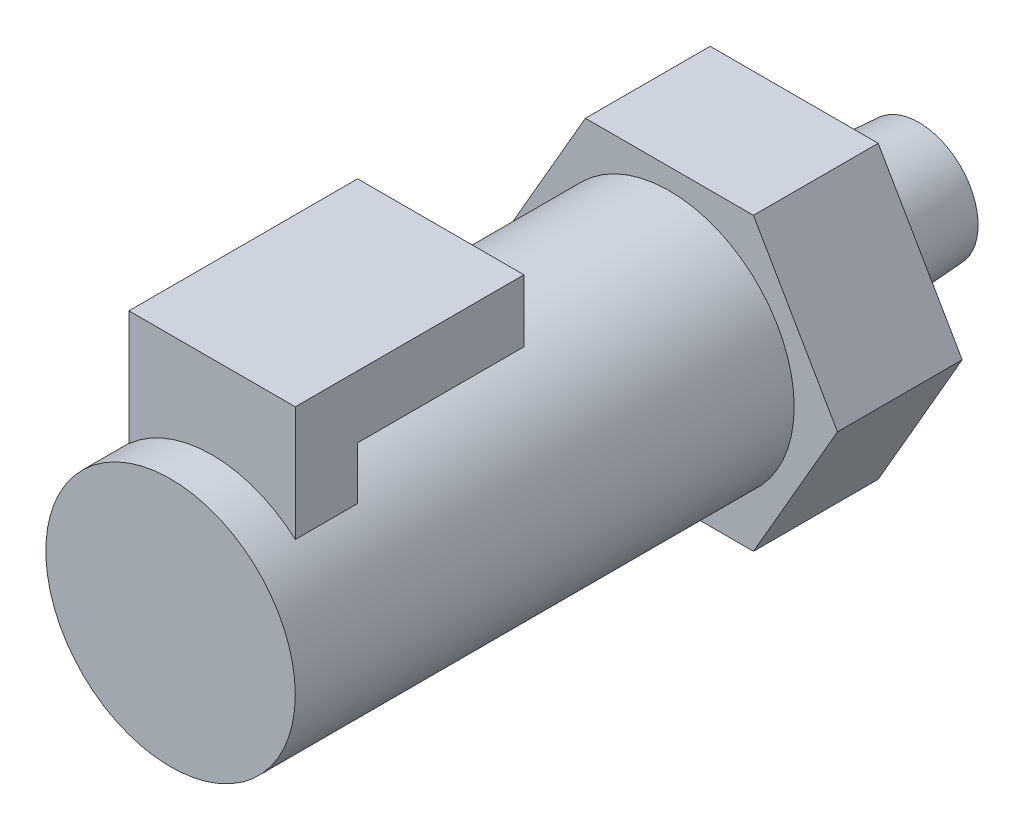
ISO-10303-21;
HEADER;
FILE_DESCRIPTION(('STEP AP214'),'2;1');
FILE_NAME('part.step','',(''),(''),'','','');
FILE_SCHEMA(('AUTOMOTIVE_DESIGN { 1 0 10303 214 1 1 1 1 }'));
ENDSEC;
DATA;
#1=APPLICATION_CONTEXT('core data for automotive mechanical design processes');
#2=APPLICATION_PROTOCOL_DEFINITION('international standard','automotive_design',2000,#1);
#3=PRODUCT_CONTEXT('',#1,'mechanical');
#4=PRODUCT('Part','Part','',(#3));
#5=PRODUCT_RELATED_PRODUCT_CATEGORY('part','',(#4));
#6=PRODUCT_DEFINITION_FORMATION('','',#4);
#7=PRODUCT_DEFINITION_CONTEXT('part definition',#1,'design');
#8=PRODUCT_DEFINITION('design','',#6,#7);
#9=PRODUCT_DEFINITION_SHAPE('','',#8);
#10=(LENGTH_UNIT() NAMED_UNIT(*) SI_UNIT(.MILLI.,.METRE.));
#11=(NAMED_UNIT(*) PLANE_ANGLE_UNIT() SI_UNIT($,.RADIAN.));
#12=(NAMED_UNIT(*) SI_UNIT($,.STERADIAN.) SOLID_ANGLE_UNIT());
#13=UNCERTAINTY_MEASURE_WITH_UNIT(LENGTH_MEASURE(1.E-05),#10,'distance_accuracy_value','');
#14=(GEOMETRIC_REPRESENTATION_CONTEXT(3) GLOBAL_UNCERTAINTY_ASSIGNED_CONTEXT((#13)) GLOBAL_UNIT_ASSIGNED_CONTEXT((#10,
#11,#12)) REPRESENTATION_CONTEXT('',''));
#15=CARTESIAN_POINT('',(0.,0.,0.));
#16=DIRECTION('',(0.,0.,1.));
#17=DIRECTION('',(1.,0.,0.));
#18=AXIS2_PLACEMENT_3D('',#15,#16,#17);
#19=CARTESIAN_POINT('',(-6.35,0.,39.6875));
#20=DIRECTION('',(0.,0.,-1.));
#21=DIRECTION('',(-1.,0.,0.));
#22=AXIS2_PLACEMENT_3D('',#19,#20,#21);
#23=PLANE('',#22);
#24=DIRECTION('',(0.,1.,0.));
#25=VECTOR('',#24,1.);
#26=CARTESIAN_POINT('',(-6.35,0.,39.6875));
#27=LINE('',#26,#25);
#28=CARTESIAN_POINT('',(-6.34999999999999,7.09951582856184,39.6875));
#29=VERTEX_POINT('',#28);
#30=CARTESIAN_POINT('',(-6.34999999999999,11.1125,39.6875));
#31=VERTEX_POINT('',#30);
#32=EDGE_CURVE('E171',#29,#31,#27,.T.);
#33=ORIENTED_EDGE('',*,*,#32,.T.);
#34=DIRECTION('',(-1.,0.,0.));
#35=VECTOR('',#34,1.);
#36=CARTESIAN_POINT('',(6.35,11.1125,39.6875));
#37=LINE('',#36,#35);
#38=CARTESIAN_POINT('',(6.35,11.1125,39.6875));
#39=VERTEX_POINT('',#38);
#40=EDGE_CURVE('E403',#39,#31,#37,.T.);
#41=ORIENTED_EDGE('',*,*,#40,.F.);
#42=DIRECTION('',(0.,1.,0.));
#43=VECTOR('',#42,1.);
#44=CARTESIAN_POINT('',(6.35,0.,39.6875));
#45=LINE('',#44,#43);
#46=CARTESIAN_POINT('',(6.35,7.09951582856183,39.6875));
#47=VERTEX_POINT('',#46);
#48=EDGE_CURVE('E173',#47,#39,#45,.T.);
#49=ORIENTED_EDGE('',*,*,#48,.F.);
#50=CARTESIAN_POINT('',(0.,0.,39.6875));
#51=DIRECTION('',(0.,0.,-1.));
#52=DIRECTION('',(-1.,0.,0.));
#53=AXIS2_PLACEMENT_3D('',#50,#51,#52);
#54=CIRCLE('',#53,9.525);
#55=EDGE_CURVE('E40',#29,#47,#54,.T.);
#56=ORIENTED_EDGE('',*,*,#55,.F.);
#57=EDGE_LOOP('',(#33,#41,#49,#56));
#58=FACE_BOUND('',#57,.T.);
#59=ADVANCED_FACE('F32',(#58),#23,.T.);
#60=CARTESIAN_POINT('',(12.8316097327394,0.,9.525));
#61=DIRECTION('',(-0.866025403784439,-0.5,0.));
#62=DIRECTION('',(0.5,-0.866025403784438,0.));
#63=AXIS2_PLACEMENT_3D('',#60,#61,#62);
#64=PLANE('',#63);
#65=DIRECTION('',(-0.5,0.866025403784438,0.));
#66=VECTOR('',#65,1.);
#67=CARTESIAN_POINT('',(12.8316097327394,0.,0.));
#68=LINE('',#67,#66);
#69=CARTESIAN_POINT('',(12.8316097327394,0.,0.));
#70=VERTEX_POINT('',#69);
#71=CARTESIAN_POINT('',(6.41580486636971,11.1125,0.));
#72=VERTEX_POINT('',#71);
#73=EDGE_CURVE('E129',#70,#72,#68,.T.);
#74=ORIENTED_EDGE('',*,*,#73,.T.);
#75=DIRECTION('',(0.,0.,-1.));
#76=VECTOR('',#75,1.);
#77=CARTESIAN_POINT('',(6.41580486636971,11.1125,9.525));
#78=LINE('',#77,#76);
#79=CARTESIAN_POINT('',(6.41580486636971,11.1125,9.525));
#80=VERTEX_POINT('',#79);
#81=EDGE_CURVE('E148',#80,#72,#78,.T.);
#82=ORIENTED_EDGE('',*,*,#81,.F.);
#83=DIRECTION('',(-0.5,0.866025403784438,0.));
#84=VECTOR('',#83,1.);
#85=CARTESIAN_POINT('',(12.8316097327394,0.,9.525));
#86=LINE('',#85,#84);
#87=CARTESIAN_POINT('',(12.8316097327394,0.,9.525));
#88=VERTEX_POINT('',#87);
#89=EDGE_CURVE('E141',#88,#80,#86,.T.);
#90=ORIENTED_EDGE('',*,*,#89,.F.);
#91=DIRECTION('',(0.,0.,-1.));
#92=VECTOR('',#91,1.);
#93=CARTESIAN_POINT('',(12.8316097327394,0.,9.525));
#94=LINE('',#93,#92);
#95=EDGE_CURVE('E125',#88,#70,#94,.T.);
#96=ORIENTED_EDGE('',*,*,#95,.T.);
#97=EDGE_LOOP('',(#74,#82,#90,#96));
#98=FACE_BOUND('',#97,.T.);
#99=ADVANCED_FACE('F34',(#98),#64,.F.);
#100=CARTESIAN_POINT('',(6.41580486636971,11.1125,9.525));
#101=DIRECTION('',(0.,-1.,0.));
#102=DIRECTION('',(1.,0.,0.));
#103=AXIS2_PLACEMENT_3D('',#100,#101,#102);
#104=PLANE('',#103);
#105=DIRECTION('',(-1.,0.,0.));
#106=VECTOR('',#105,1.);
#107=CARTESIAN_POINT('',(6.41580486636971,11.1125,0.));
#108=LINE('',#107,#106);
#109=CARTESIAN_POINT('',(-6.41580486636972,11.1125,0.));
#110=VERTEX_POINT('',#109);
#111=EDGE_CURVE('E132',#72,#110,#108,.T.);
#112=ORIENTED_EDGE('',*,*,#111,.T.);
#113=DIRECTION('',(0.,0.,-1.));
#114=VECTOR('',#113,1.);
#115=CARTESIAN_POINT('',(-6.41580486636972,11.1125,9.525));
#116=LINE('',#115,#114);
#117=CARTESIAN_POINT('',(-6.41580486636972,11.1125,9.525));
#118=VERTEX_POINT('',#117);
#119=EDGE_CURVE('E145',#118,#110,#116,.T.);
#120=ORIENTED_EDGE('',*,*,#119,.F.);
#121=DIRECTION('',(-1.,0.,0.));
#122=VECTOR('',#121,1.);
#123=CARTESIAN_POINT('',(6.41580486636971,11.1125,9.525));
#124=LINE('',#123,#122);
#125=EDGE_CURVE('E92',#80,#118,#124,.T.);
#126=ORIENTED_EDGE('',*,*,#125,.F.);
#127=ORIENTED_EDGE('',*,*,#81,.T.);
#128=EDGE_LOOP('',(#112,#120,#126,#127));
#129=FACE_BOUND('',#128,.T.);
#130=ADVANCED_FACE('F202',(#129),#104,.F.);
#131=CARTESIAN_POINT('',(-6.41580486636972,11.1125,9.525));
#132=DIRECTION('',(0.866025403784439,-0.5,0.));
#133=DIRECTION('',(0.5,0.866025403784438,0.));
#134=AXIS2_PLACEMENT_3D('',#131,#132,#133);
#135=PLANE('',#134);
#136=DIRECTION('',(-0.5,-0.866025403784438,0.));
#137=VECTOR('',#136,1.);
#138=CARTESIAN_POINT('',(-6.41580486636972,11.1125,0.));
#139=LINE('',#138,#137);
#140=CARTESIAN_POINT('',(-12.8316097327394,0.,0.));
#141=VERTEX_POINT('',#140);
#142=EDGE_CURVE('E135',#110,#141,#139,.T.);
#143=ORIENTED_EDGE('',*,*,#142,.T.);
#144=DIRECTION('',(0.,0.,-1.));
#145=VECTOR('',#144,1.);
#146=CARTESIAN_POINT('',(-12.8316097327394,0.,9.525));
#147=LINE('',#146,#145);
#148=CARTESIAN_POINT('',(-12.8316097327394,0.,9.525));
#149=VERTEX_POINT('',#148);
#150=EDGE_CURVE('E120',#149,#141,#147,.T.);
#151=ORIENTED_EDGE('',*,*,#150,.F.);
#152=DIRECTION('',(-0.5,-0.866025403784438,0.));
#153=VECTOR('',#152,1.);
#154=CARTESIAN_POINT('',(-6.41580486636972,11.1125,9.525));
#155=LINE('',#154,#153);
#156=EDGE_CURVE('E108',#118,#149,#155,.T.);
#157=ORIENTED_EDGE('',*,*,#156,.F.);
#158=ORIENTED_EDGE('',*,*,#119,.T.);
#159=EDGE_LOOP('',(#143,#151,#157,#158));
#160=FACE_BOUND('',#159,.T.);
#161=ADVANCED_FACE('F205',(#160),#135,.F.);
#162=CARTESIAN_POINT('',(-12.8316097327394,0.,9.525));
#163=DIRECTION('',(0.866025403784439,0.5,0.));
#164=DIRECTION('',(-0.5,0.866025403784439,0.));
#165=AXIS2_PLACEMENT_3D('',#162,#163,#164);
#166=PLANE('',#165);
#167=DIRECTION('',(0.5,-0.866025403784439,0.));
#168=VECTOR('',#167,1.);
#169=CARTESIAN_POINT('',(-12.8316097327394,0.,0.));
#170=LINE('',#169,#168);
#171=CARTESIAN_POINT('',(-6.41580486636971,-11.1125,0.));
#172=VERTEX_POINT('',#171);
#173=EDGE_CURVE('E117',#141,#172,#170,.T.);
#174=ORIENTED_EDGE('',*,*,#173,.T.);
#175=DIRECTION('',(0.,0.,-1.));
#176=VECTOR('',#175,1.);
#177=CARTESIAN_POINT('',(-6.41580486636971,-11.1125,9.525));
#178=LINE('',#177,#176);
#179=CARTESIAN_POINT('',(-6.41580486636971,-11.1125,9.525));
#180=VERTEX_POINT('',#179);
#181=EDGE_CURVE('E114',#180,#172,#178,.T.);
#182=ORIENTED_EDGE('',*,*,#181,.F.);
#183=DIRECTION('',(0.5,-0.866025403784439,0.));
#184=VECTOR('',#183,1.);
#185=CARTESIAN_POINT('',(-12.8316097327394,0.,9.525));
#186=LINE('',#185,#184);
#187=EDGE_CURVE('E101',#149,#180,#186,.T.);
#188=ORIENTED_EDGE('',*,*,#187,.F.);
#189=ORIENTED_EDGE('',*,*,#150,.T.);
#190=EDGE_LOOP('',(#174,#182,#188,#189));
#191=FACE_BOUND('',#190,.T.);
#192=ADVANCED_FACE('F115',(#191),#166,.F.);
#193=CARTESIAN_POINT('',(-6.41580486636971,-11.1125,9.525));
#194=DIRECTION('',(0.,1.,0.));
#195=DIRECTION('',(0.,0.,1.));
#196=AXIS2_PLACEMENT_3D('',#193,#194,#195);
#197=PLANE('',#196);
#198=DIRECTION('',(1.,0.,0.));
#199=VECTOR('',#198,1.);
#200=CARTESIAN_POINT('',(-6.41580486636971,-11.1125,0.));
#201=LINE('',#200,#199);
#202=CARTESIAN_POINT('',(6.41580486636971,-11.1125,0.));
#203=VERTEX_POINT('',#202);
#204=EDGE_CURVE('E138',#172,#203,#201,.T.);
#205=ORIENTED_EDGE('',*,*,#204,.T.);
#206=DIRECTION('',(0.,0.,-1.));
#207=VECTOR('',#206,1.);
#208=CARTESIAN_POINT('',(6.41580486636971,-11.1125,9.525));
#209=LINE('',#208,#207);
#210=CARTESIAN_POINT('',(6.41580486636971,-11.1125,9.525));
#211=VERTEX_POINT('',#210);
#212=EDGE_CURVE('E121',#211,#203,#209,.T.);
#213=ORIENTED_EDGE('',*,*,#212,.F.);
#214=DIRECTION('',(1.,0.,0.));
#215=VECTOR('',#214,1.);
#216=CARTESIAN_POINT('',(-6.41580486636971,-11.1125,9.525));
#217=LINE('',#216,#215);
#218=EDGE_CURVE('E105',#180,#211,#217,.T.);
#219=ORIENTED_EDGE('',*,*,#218,.F.);
#220=ORIENTED_EDGE('',*,*,#181,.T.);
#221=EDGE_LOOP('',(#205,#213,#219,#220));
#222=FACE_BOUND('',#221,.T.);
#223=ADVANCED_FACE('F123',(#222),#197,.F.);
#224=CARTESIAN_POINT('',(6.41580486636971,-11.1125,9.525));
#225=DIRECTION('',(-0.866025403784439,0.5,0.));
#226=DIRECTION('',(-0.5,-0.866025403784438,0.));
#227=AXIS2_PLACEMENT_3D('',#224,#225,#226);
#228=PLANE('',#227);
#229=DIRECTION('',(0.5,0.866025403784438,0.));
#230=VECTOR('',#229,1.);
#231=CARTESIAN_POINT('',(6.41580486636971,-11.1125,0.));
#232=LINE('',#231,#230);
#233=EDGE_CURVE('E83',#203,#70,#232,.T.);
#234=ORIENTED_EDGE('',*,*,#233,.T.);
#235=ORIENTED_EDGE('',*,*,#95,.F.);
#236=DIRECTION('',(0.5,0.866025403784438,0.));
#237=VECTOR('',#236,1.);
#238=CARTESIAN_POINT('',(6.41580486636971,-11.1125,9.525));
#239=LINE('',#238,#237);
#240=EDGE_CURVE('E56',#211,#88,#239,.T.);
#241=ORIENTED_EDGE('',*,*,#240,.F.);
#242=ORIENTED_EDGE('',*,*,#212,.T.);
#243=EDGE_LOOP('',(#234,#235,#241,#242));
#244=FACE_BOUND('',#243,.T.);
#245=ADVANCED_FACE('F209',(#244),#228,.F.);
#246=CARTESIAN_POINT('',(0.,0.,9.525));
#247=DIRECTION('',(0.,0.,1.));
#248=DIRECTION('',(1.,0.,0.));
#249=AXIS2_PLACEMENT_3D('',#246,#247,#248);
#250=PLANE('',#249);
#251=CARTESIAN_POINT('',(0.,0.,9.525));
#252=DIRECTION('',(0.,0.,1.));
#253=DIRECTION('',(1.,0.,0.));
#254=AXIS2_PLACEMENT_3D('',#251,#252,#253);
#255=CIRCLE('',#254,9.525);
#256=CARTESIAN_POINT('',(9.525,0.,9.525));
#257=VERTEX_POINT('',#256);
#258=EDGE_CURVE('E155',#257,#257,#255,.T.);
#259=ORIENTED_EDGE('',*,*,#258,.F.);
#260=EDGE_LOOP('',(#259));
#261=FACE_BOUND('',#260,.T.);
#262=ORIENTED_EDGE('',*,*,#89,.T.);
#263=ORIENTED_EDGE('',*,*,#125,.T.);
#264=ORIENTED_EDGE('',*,*,#156,.T.);
#265=ORIENTED_EDGE('',*,*,#187,.T.);
#266=ORIENTED_EDGE('',*,*,#218,.T.);
#267=ORIENTED_EDGE('',*,*,#240,.T.);
#268=EDGE_LOOP('',(#262,#263,#264,#265,#266,#267));
#269=FACE_BOUND('',#268,.T.);
#270=ADVANCED_FACE('F103',(#261,#269),#250,.T.);
#271=CARTESIAN_POINT('',(0.,0.,0.));
#272=DIRECTION('',(0.,0.,1.));
#273=DIRECTION('',(1.,0.,0.));
#274=AXIS2_PLACEMENT_3D('',#271,#272,#273);
#275=PLANE('',#274);
#276=CARTESIAN_POINT('',(0.,0.,0.));
#277=DIRECTION('',(0.,0.,-1.));
#278=DIRECTION('',(-1.,0.,0.));
#279=AXIS2_PLACEMENT_3D('',#276,#277,#278);
#280=CIRCLE('',#279,5.1054);
#281=CARTESIAN_POINT('',(-5.1054,0.,0.));
#282=VERTEX_POINT('',#281);
#283=EDGE_CURVE('E150',#282,#282,#280,.T.);
#284=ORIENTED_EDGE('',*,*,#283,.F.);
#285=EDGE_LOOP('',(#284));
#286=FACE_BOUND('',#285,.T.);
#287=ORIENTED_EDGE('',*,*,#73,.F.);
#288=ORIENTED_EDGE('',*,*,#233,.F.);
#289=ORIENTED_EDGE('',*,*,#204,.F.);
#290=ORIENTED_EDGE('',*,*,#173,.F.);
#291=ORIENTED_EDGE('',*,*,#142,.F.);
#292=ORIENTED_EDGE('',*,*,#111,.F.);
#293=EDGE_LOOP('',(#287,#288,#289,#290,#291,#292));
#294=FACE_BOUND('',#293,.T.);
#295=ADVANCED_FACE('F208',(#286,#294),#275,.F.);
#296=CARTESIAN_POINT('',(0.,0.,0.));
#297=DIRECTION('',(0.,0.,1.));
#298=DIRECTION('',(-1.,0.,0.));
#299=AXIS2_PLACEMENT_3D('',#296,#297,#298);
#300=CONICAL_SURFACE('',#299,5.1054,0.0610865238198017);
#301=CARTESIAN_POINT('',(0.,0.,-9.525));
#302=DIRECTION('',(0.,0.,-1.));
#303=DIRECTION('',(-1.,0.,0.));
#304=AXIS2_PLACEMENT_3D('',#301,#302,#303);
#305=CIRCLE('',#304,4.52282604306664);
#306=CARTESIAN_POINT('',(-4.52282604306664,0.,-9.525));
#307=VERTEX_POINT('',#306);
#308=EDGE_CURVE('E133',#307,#307,#305,.T.);
#309=ORIENTED_EDGE('',*,*,#308,.F.);
#310=EDGE_LOOP('',(#309));
#311=FACE_BOUND('',#310,.T.);
#312=ORIENTED_EDGE('',*,*,#283,.T.);
#313=EDGE_LOOP('',(#312));
#314=FACE_BOUND('',#313,.T.);
#315=ADVANCED_FACE('F241',(#311,#314),#300,.T.);
#316=CARTESIAN_POINT('',(0.,0.,-9.525));
#317=DIRECTION('',(0.,0.,-1.));
#318=DIRECTION('',(-1.,0.,0.));
#319=AXIS2_PLACEMENT_3D('',#316,#317,#318);
#320=PLANE('',#319);
#321=ORIENTED_EDGE('',*,*,#308,.T.);
#322=EDGE_LOOP('',(#321));
#323=FACE_BOUND('',#322,.T.);
#324=ADVANCED_FACE('F238',(#323),#320,.T.);
#325=CARTESIAN_POINT('',(0.,0.,47.625));
#326=DIRECTION('',(0.,0.,-1.));
#327=DIRECTION('',(-1.,0.,0.));
#328=AXIS2_PLACEMENT_3D('',#325,#326,#327);
#329=CYLINDRICAL_SURFACE('',#328,9.525);
#330=CARTESIAN_POINT('',(0.,0.,44.45));
#331=DIRECTION('',(0.,0.,1.));
#332=DIRECTION('',(1.,0.,0.));
#333=AXIS2_PLACEMENT_3D('',#330,#331,#332);
#334=CIRCLE('',#333,9.525);
#335=CARTESIAN_POINT('',(6.35,7.09951582856183,44.45));
#336=VERTEX_POINT('',#335);
#337=CARTESIAN_POINT('',(-6.34999999999999,7.09951582856184,44.45));
#338=VERTEX_POINT('',#337);
#339=EDGE_CURVE('E151',#336,#338,#334,.T.);
#340=ORIENTED_EDGE('',*,*,#339,.T.);
#341=DIRECTION('',(0.,0.,-1.));
#342=VECTOR('',#341,1.);
#343=CARTESIAN_POINT('',(-6.34999999999999,7.09951582856184,47.625));
#344=LINE('',#343,#342);
#345=EDGE_CURVE('E11',#338,#29,#344,.T.);
#346=ORIENTED_EDGE('',*,*,#345,.T.);
#347=ORIENTED_EDGE('',*,*,#55,.T.);
#348=DIRECTION('',(0.,0.,-1.));
#349=VECTOR('',#348,1.);
#350=CARTESIAN_POINT('',(6.35,7.09951582856183,47.625));
#351=LINE('',#350,#349);
#352=EDGE_CURVE('E154',#47,#336,#351,.F.);
#353=ORIENTED_EDGE('',*,*,#352,.T.);
#354=EDGE_LOOP('',(#340,#346,#347,#353));
#355=FACE_BOUND('',#354,.T.);
#356=CARTESIAN_POINT('',(0.,0.,47.625));
#357=DIRECTION('',(0.,0.,1.));
#358=DIRECTION('',(1.,0.,0.));
#359=AXIS2_PLACEMENT_3D('',#356,#357,#358);
#360=CIRCLE('',#359,9.525);
#361=CARTESIAN_POINT('',(9.525,0.,47.625));
#362=VERTEX_POINT('',#361);
#363=EDGE_CURVE('E180',#362,#362,#360,.T.);
#364=ORIENTED_EDGE('',*,*,#363,.F.);
#365=EDGE_LOOP('',(#364));
#366=FACE_BOUND('',#365,.T.);
#367=ORIENTED_EDGE('',*,*,#258,.T.);
#368=EDGE_LOOP('',(#367));
#369=FACE_BOUND('',#368,.T.);
#370=ADVANCED_FACE('F161',(#355,#366,#369),#329,.T.);
#371=CARTESIAN_POINT('',(0.,0.,47.625));
#372=DIRECTION('',(0.,0.,1.));
#373=DIRECTION('',(1.,0.,0.));
#374=AXIS2_PLACEMENT_3D('',#371,#372,#373);
#375=PLANE('',#374);
#376=ORIENTED_EDGE('',*,*,#363,.T.);
#377=EDGE_LOOP('',(#376));
#378=FACE_BOUND('',#377,.T.);
#379=ADVANCED_FACE('F232',(#378),#375,.T.);
#380=CARTESIAN_POINT('',(-6.34999999999999,0.,44.45));
#381=DIRECTION('',(-1.,0.,0.));
#382=DIRECTION('',(0.,0.,1.));
#383=AXIS2_PLACEMENT_3D('',#380,#381,#382);
#384=PLANE('',#383);
#385=ORIENTED_EDGE('',*,*,#345,.F.);
#386=DIRECTION('',(0.,1.,0.));
#387=VECTOR('',#386,1.);
#388=CARTESIAN_POINT('',(-6.34999999999999,0.,44.45));
#389=LINE('',#388,#387);
#390=CARTESIAN_POINT('',(-6.34999999999999,15.875,44.45));
#391=VERTEX_POINT('',#390);
#392=EDGE_CURVE('E47',#338,#391,#389,.T.);
#393=ORIENTED_EDGE('',*,*,#392,.T.);
#394=DIRECTION('',(0.,0.,1.));
#395=VECTOR('',#394,1.);
#396=CARTESIAN_POINT('',(-6.34999999999999,15.875,44.45));
#397=LINE('',#396,#395);
#398=CARTESIAN_POINT('',(-6.34999999999999,15.875,26.9875));
#399=VERTEX_POINT('',#398);
#400=EDGE_CURVE('E409',#399,#391,#397,.T.);
#401=ORIENTED_EDGE('',*,*,#400,.F.);
#402=DIRECTION('',(0.,1.,0.));
#403=VECTOR('',#402,1.);
#404=CARTESIAN_POINT('',(-6.34999999999999,15.875,26.9875));
#405=LINE('',#404,#403);
#406=CARTESIAN_POINT('',(-6.34999999999999,11.1125,26.9875));
#407=VERTEX_POINT('',#406);
#408=EDGE_CURVE('E431',#407,#399,#405,.T.);
#409=ORIENTED_EDGE('',*,*,#408,.F.);
#410=DIRECTION('',(0.,0.,1.));
#411=VECTOR('',#410,1.);
#412=CARTESIAN_POINT('',(-6.34999999999999,11.1125,26.9875));
#413=LINE('',#412,#411);
#414=EDGE_CURVE('E179',#407,#31,#413,.T.);
#415=ORIENTED_EDGE('',*,*,#414,.T.);
#416=ORIENTED_EDGE('',*,*,#32,.F.);
#417=EDGE_LOOP('',(#385,#393,#401,#409,#415,#416));
#418=FACE_BOUND('',#417,.T.);
#419=ADVANCED_FACE('F176',(#418),#384,.T.);
#420=CARTESIAN_POINT('',(6.35,0.,44.45));
#421=DIRECTION('',(1.,0.,0.));
#422=DIRECTION('',(0.,0.,-1.));
#423=AXIS2_PLACEMENT_3D('',#420,#421,#422);
#424=PLANE('',#423);
#425=ORIENTED_EDGE('',*,*,#352,.F.);
#426=ORIENTED_EDGE('',*,*,#48,.T.);
#427=DIRECTION('',(0.,0.,1.));
#428=VECTOR('',#427,1.);
#429=CARTESIAN_POINT('',(6.35,11.1125,26.9875));
#430=LINE('',#429,#428);
#431=CARTESIAN_POINT('',(6.35,11.1125,26.9875));
#432=VERTEX_POINT('',#431);
#433=EDGE_CURVE('E406',#432,#39,#430,.T.);
#434=ORIENTED_EDGE('',*,*,#433,.F.);
#435=DIRECTION('',(0.,-1.,0.));
#436=VECTOR('',#435,1.);
#437=CARTESIAN_POINT('',(6.35,15.875,26.9875));
#438=LINE('',#437,#436);
#439=CARTESIAN_POINT('',(6.35,15.875,26.9875));
#440=VERTEX_POINT('',#439);
#441=EDGE_CURVE('E392',#440,#432,#438,.T.);
#442=ORIENTED_EDGE('',*,*,#441,.F.);
#443=DIRECTION('',(0.,0.,-1.));
#444=VECTOR('',#443,1.);
#445=CARTESIAN_POINT('',(6.35,15.875,44.45));
#446=LINE('',#445,#444);
#447=CARTESIAN_POINT('',(6.35,15.875,44.45));
#448=VERTEX_POINT('',#447);
#449=EDGE_CURVE('E187',#448,#440,#446,.T.);
#450=ORIENTED_EDGE('',*,*,#449,.F.);
#451=DIRECTION('',(0.,1.,0.));
#452=VECTOR('',#451,1.);
#453=CARTESIAN_POINT('',(6.35,0.,44.45));
#454=LINE('',#453,#452);
#455=EDGE_CURVE('E184',#336,#448,#454,.T.);
#456=ORIENTED_EDGE('',*,*,#455,.F.);
#457=EDGE_LOOP('',(#425,#426,#434,#442,#450,#456));
#458=FACE_BOUND('',#457,.T.);
#459=ADVANCED_FACE('F223',(#458),#424,.T.);
#460=CARTESIAN_POINT('',(-6.34999999999999,0.,44.45));
#461=DIRECTION('',(0.,0.,1.));
#462=DIRECTION('',(1.,0.,0.));
#463=AXIS2_PLACEMENT_3D('',#460,#461,#462);
#464=PLANE('',#463);
#465=ORIENTED_EDGE('',*,*,#339,.F.);
#466=ORIENTED_EDGE('',*,*,#455,.T.);
#467=DIRECTION('',(1.,0.,0.));
#468=VECTOR('',#467,1.);
#469=CARTESIAN_POINT('',(-6.34999999999999,15.875,44.45));
#470=LINE('',#469,#468);
#471=EDGE_CURVE('E412',#391,#448,#470,.T.);
#472=ORIENTED_EDGE('',*,*,#471,.F.);
#473=ORIENTED_EDGE('',*,*,#392,.F.);
#474=EDGE_LOOP('',(#465,#466,#472,#473));
#475=FACE_BOUND('',#474,.T.);
#476=ADVANCED_FACE('F226',(#475),#464,.T.);
#477=CARTESIAN_POINT('',(0.,15.875,0.));
#478=DIRECTION('',(0.,-1.,0.));
#479=DIRECTION('',(0.,0.,-1.));
#480=AXIS2_PLACEMENT_3D('',#477,#478,#479);
#481=PLANE('',#480);
#482=ORIENTED_EDGE('',*,*,#400,.T.);
#483=ORIENTED_EDGE('',*,*,#471,.T.);
#484=ORIENTED_EDGE('',*,*,#449,.T.);
#485=DIRECTION('',(1.,0.,0.));
#486=VECTOR('',#485,1.);
#487=CARTESIAN_POINT('',(6.35,15.875,26.9875));
#488=LINE('',#487,#486);
#489=EDGE_CURVE('E400',#399,#440,#488,.T.);
#490=ORIENTED_EDGE('',*,*,#489,.F.);
#491=EDGE_LOOP('',(#482,#483,#484,#490));
#492=FACE_BOUND('',#491,.T.);
#493=ADVANCED_FACE('F221',(#492),#481,.F.);
#494=CARTESIAN_POINT('',(6.35,11.1125,26.9875));
#495=DIRECTION('',(0.,1.,0.));
#496=DIRECTION('',(-1.,0.,0.));
#497=AXIS2_PLACEMENT_3D('',#494,#495,#496);
#498=PLANE('',#497);
#499=ORIENTED_EDGE('',*,*,#40,.T.);
#500=ORIENTED_EDGE('',*,*,#414,.F.);
#501=DIRECTION('',(-1.,0.,0.));
#502=VECTOR('',#501,1.);
#503=CARTESIAN_POINT('',(6.35,11.1125,26.9875));
#504=LINE('',#503,#502);
#505=EDGE_CURVE('E397',#432,#407,#504,.T.);
#506=ORIENTED_EDGE('',*,*,#505,.F.);
#507=ORIENTED_EDGE('',*,*,#433,.T.);
#508=EDGE_LOOP('',(#499,#500,#506,#507));
#509=FACE_BOUND('',#508,.T.);
#510=ADVANCED_FACE('F317',(#509),#498,.F.);
#511=CARTESIAN_POINT('',(0.,0.,26.9875));
#512=DIRECTION('',(0.,0.,-1.));
#513=DIRECTION('',(-1.,0.,0.));
#514=AXIS2_PLACEMENT_3D('',#511,#512,#513);
#515=PLANE('',#514);
#516=ORIENTED_EDGE('',*,*,#441,.T.);
#517=ORIENTED_EDGE('',*,*,#505,.T.);
#518=ORIENTED_EDGE('',*,*,#408,.T.);
#519=ORIENTED_EDGE('',*,*,#489,.T.);
#520=EDGE_LOOP('',(#516,#517,#518,#519));
#521=FACE_BOUND('',#520,.T.);
#522=ADVANCED_FACE('F324',(#521),#515,.T.);
#523=CLOSED_SHELL('',(#59,#99,#130,#161,#192,#223,#245,#270,#295,#315,#324,#370,#379,#419,#459,
#476,#493,#510,#522));
#524=MANIFOLD_SOLID_BREP('B2',#523);
#525=ADVANCED_BREP_SHAPE_REPRESENTATION('',(#18,#524),#14);
#526=SHAPE_DEFINITION_REPRESENTATION(#9,#525);
ENDSEC;
END-ISO-10303-21;
